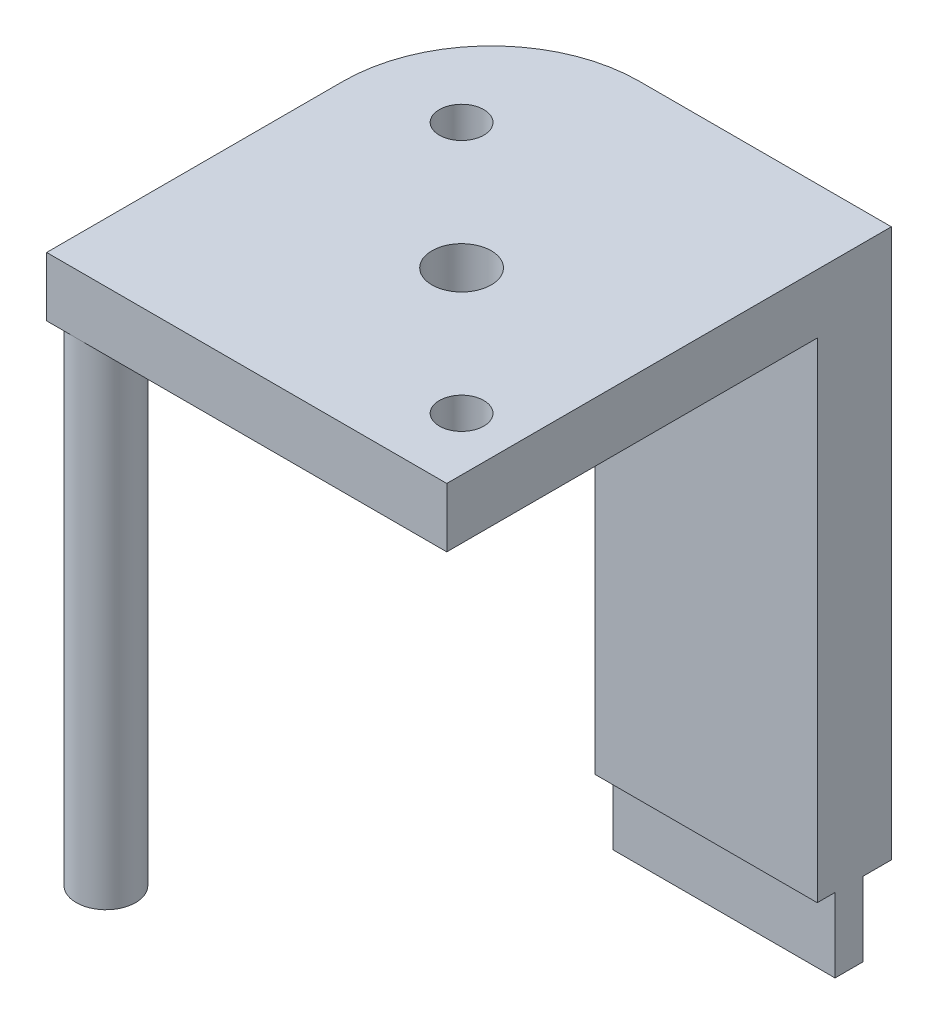
ISO-10303-21;
HEADER;
FILE_DESCRIPTION(('STEP AP214'),'2;1');
FILE_NAME('part.step','',(''),(''),'','','');
FILE_SCHEMA(('AUTOMOTIVE_DESIGN { 1 0 10303 214 1 1 1 1 }'));
ENDSEC;
DATA;
#1=APPLICATION_CONTEXT('core data for automotive mechanical design processes');
#2=APPLICATION_PROTOCOL_DEFINITION('international standard','automotive_design',2000,#1);
#3=PRODUCT_CONTEXT('',#1,'mechanical');
#4=PRODUCT('Part','Part','',(#3));
#5=PRODUCT_RELATED_PRODUCT_CATEGORY('part','',(#4));
#6=PRODUCT_DEFINITION_FORMATION('','',#4);
#7=PRODUCT_DEFINITION_CONTEXT('part definition',#1,'design');
#8=PRODUCT_DEFINITION('design','',#6,#7);
#9=PRODUCT_DEFINITION_SHAPE('','',#8);
#10=(LENGTH_UNIT() NAMED_UNIT(*) SI_UNIT(.MILLI.,.METRE.));
#11=(NAMED_UNIT(*) PLANE_ANGLE_UNIT() SI_UNIT($,.RADIAN.));
#12=(NAMED_UNIT(*) SI_UNIT($,.STERADIAN.) SOLID_ANGLE_UNIT());
#13=UNCERTAINTY_MEASURE_WITH_UNIT(LENGTH_MEASURE(1.E-05),#10,'distance_accuracy_value','');
#14=(GEOMETRIC_REPRESENTATION_CONTEXT(3) GLOBAL_UNCERTAINTY_ASSIGNED_CONTEXT((#13)) GLOBAL_UNIT_ASSIGNED_CONTEXT((#10,
#11,#12)) REPRESENTATION_CONTEXT('',''));
#15=CARTESIAN_POINT('',(0.,0.,0.));
#16=DIRECTION('',(0.,0.,1.));
#17=DIRECTION('',(1.,0.,0.));
#18=AXIS2_PLACEMENT_3D('',#15,#16,#17);
#19=CARTESIAN_POINT('',(-3.5,0.,-5.));
#20=DIRECTION('',(0.,-1.,0.));
#21=DIRECTION('',(0.,0.,-1.));
#22=AXIS2_PLACEMENT_3D('',#19,#20,#21);
#23=PLANE('',#22);
#24=DIRECTION('',(-1.,0.,0.));
#25=VECTOR('',#24,1.);
#26=CARTESIAN_POINT('',(-1.5,0.,-11.2));
#27=LINE('',#26,#25);
#28=CARTESIAN_POINT('',(13.5,0.,-11.2));
#29=VERTEX_POINT('',#28);
#30=CARTESIAN_POINT('',(-1.5,0.,-11.2));
#31=VERTEX_POINT('',#30);
#32=EDGE_CURVE('E89',#29,#31,#27,.T.);
#33=ORIENTED_EDGE('',*,*,#32,.F.);
#34=DIRECTION('',(0.,0.,-1.));
#35=VECTOR('',#34,1.);
#36=CARTESIAN_POINT('',(13.5,0.,-15.));
#37=LINE('',#36,#35);
#38=CARTESIAN_POINT('',(13.5,0.,-10.));
#39=VERTEX_POINT('',#38);
#40=EDGE_CURVE('E280',#39,#29,#37,.T.);
#41=ORIENTED_EDGE('',*,*,#40,.F.);
#42=DIRECTION('',(1.,0.,0.));
#43=VECTOR('',#42,1.);
#44=CARTESIAN_POINT('',(0.,0.,-10.));
#45=LINE('',#44,#43);
#46=CARTESIAN_POINT('',(-1.5,0.,-10.));
#47=VERTEX_POINT('',#46);
#48=EDGE_CURVE('E240',#47,#39,#45,.T.);
#49=ORIENTED_EDGE('',*,*,#48,.F.);
#50=DIRECTION('',(0.,0.,1.));
#51=VECTOR('',#50,1.);
#52=CARTESIAN_POINT('',(-1.5,0.,0.));
#53=LINE('',#52,#51);
#54=EDGE_CURVE('E94',#31,#47,#53,.T.);
#55=ORIENTED_EDGE('',*,*,#54,.F.);
#56=EDGE_LOOP('',(#33,#41,#49,#55));
#57=FACE_BOUND('',#56,.T.);
#58=ADVANCED_FACE('F71',(#57),#23,.T.);
#59=CARTESIAN_POINT('',(-13.5,37.,-5.));
#60=DIRECTION('',(1.,0.,0.));
#61=DIRECTION('',(0.,0.,-1.));
#62=AXIS2_PLACEMENT_3D('',#59,#60,#61);
#63=PLANE('',#62);
#64=DIRECTION('',(0.,0.,1.));
#65=VECTOR('',#64,1.);
#66=CARTESIAN_POINT('',(-13.5,33.,0.));
#67=LINE('',#66,#65);
#68=CARTESIAN_POINT('',(-13.5,33.,13.));
#69=VERTEX_POINT('',#68);
#70=CARTESIAN_POINT('',(-13.5,33.,15.));
#71=VERTEX_POINT('',#70);
#72=EDGE_CURVE('E197',#69,#71,#67,.T.);
#73=ORIENTED_EDGE('',*,*,#72,.T.);
#74=DIRECTION('',(0.,-1.,0.));
#75=VECTOR('',#74,1.);
#76=CARTESIAN_POINT('',(-13.5,37.,15.));
#77=LINE('',#76,#75);
#78=CARTESIAN_POINT('',(-13.5,37.,15.));
#79=VERTEX_POINT('',#78);
#80=EDGE_CURVE('E289',#79,#71,#77,.T.);
#81=ORIENTED_EDGE('',*,*,#80,.F.);
#82=DIRECTION('',(0.,0.,1.));
#83=VECTOR('',#82,1.);
#84=CARTESIAN_POINT('',(-13.5,37.,-5.));
#85=LINE('',#84,#83);
#86=CARTESIAN_POINT('',(-13.5,37.,-5.));
#87=VERTEX_POINT('',#86);
#88=EDGE_CURVE('E273',#87,#79,#85,.T.);
#89=ORIENTED_EDGE('',*,*,#88,.F.);
#90=DIRECTION('',(0.,-1.,0.));
#91=VECTOR('',#90,1.);
#92=CARTESIAN_POINT('',(-13.5,37.,-5.));
#93=LINE('',#92,#91);
#94=CARTESIAN_POINT('',(-13.5,33.,-5.));
#95=VERTEX_POINT('',#94);
#96=EDGE_CURVE('E293',#87,#95,#93,.T.);
#97=ORIENTED_EDGE('',*,*,#96,.T.);
#98=DIRECTION('',(0.,0.,1.));
#99=VECTOR('',#98,1.);
#100=CARTESIAN_POINT('',(-13.5,33.,0.));
#101=LINE('',#100,#99);
#102=EDGE_CURVE('E236',#95,#69,#101,.T.);
#103=ORIENTED_EDGE('',*,*,#102,.T.);
#104=EDGE_LOOP('',(#73,#81,#89,#97,#103));
#105=FACE_BOUND('',#104,.T.);
#106=ADVANCED_FACE('F378',(#105),#63,.F.);
#107=CARTESIAN_POINT('',(-13.5,37.,15.));
#108=DIRECTION('',(0.,0.,-1.));
#109=DIRECTION('',(-1.,0.,0.));
#110=AXIS2_PLACEMENT_3D('',#107,#108,#109);
#111=PLANE('',#110);
#112=DIRECTION('',(1.,0.,0.));
#113=VECTOR('',#112,1.);
#114=CARTESIAN_POINT('',(0.,33.,15.));
#115=LINE('',#114,#113);
#116=CARTESIAN_POINT('',(-11.5,33.,15.));
#117=VERTEX_POINT('',#116);
#118=EDGE_CURVE('E210',#71,#117,#115,.T.);
#119=ORIENTED_EDGE('',*,*,#118,.T.);
#120=DIRECTION('',(1.,0.,0.));
#121=VECTOR('',#120,1.);
#122=CARTESIAN_POINT('',(0.,33.,15.));
#123=LINE('',#122,#121);
#124=CARTESIAN_POINT('',(13.5,33.,15.));
#125=VERTEX_POINT('',#124);
#126=EDGE_CURVE('E228',#117,#125,#123,.T.);
#127=ORIENTED_EDGE('',*,*,#126,.T.);
#128=DIRECTION('',(0.,-1.,0.));
#129=VECTOR('',#128,1.);
#130=CARTESIAN_POINT('',(13.5,37.,15.));
#131=LINE('',#130,#129);
#132=CARTESIAN_POINT('',(13.5,37.,15.));
#133=VERTEX_POINT('',#132);
#134=EDGE_CURVE('E279',#133,#125,#131,.T.);
#135=ORIENTED_EDGE('',*,*,#134,.F.);
#136=DIRECTION('',(1.,0.,0.));
#137=VECTOR('',#136,1.);
#138=CARTESIAN_POINT('',(-13.5,37.,15.));
#139=LINE('',#138,#137);
#140=EDGE_CURVE('E276',#79,#133,#139,.T.);
#141=ORIENTED_EDGE('',*,*,#140,.F.);
#142=ORIENTED_EDGE('',*,*,#80,.T.);
#143=EDGE_LOOP('',(#119,#127,#135,#141,#142));
#144=FACE_BOUND('',#143,.T.);
#145=ADVANCED_FACE('F366',(#144),#111,.F.);
#146=CARTESIAN_POINT('',(-3.5,37.,-5.));
#147=DIRECTION('',(0.,-1.,0.));
#148=DIRECTION('',(0.,0.,-1.));
#149=AXIS2_PLACEMENT_3D('',#146,#147,#148);
#150=CYLINDRICAL_SURFACE('',#149,10.);
#151=CARTESIAN_POINT('',(-3.5,33.,-5.));
#152=DIRECTION('',(0.,-1.,0.));
#153=DIRECTION('',(0.,0.,-1.));
#154=AXIS2_PLACEMENT_3D('',#151,#152,#153);
#155=CIRCLE('',#154,10.);
#156=CARTESIAN_POINT('',(-3.5,33.,-15.));
#157=VERTEX_POINT('',#156);
#158=EDGE_CURVE('E258',#95,#157,#155,.T.);
#159=ORIENTED_EDGE('',*,*,#158,.F.);
#160=ORIENTED_EDGE('',*,*,#96,.F.);
#161=CARTESIAN_POINT('',(-3.5,37.,-5.));
#162=DIRECTION('',(0.,1.,0.));
#163=DIRECTION('',(0.,0.,-1.));
#164=AXIS2_PLACEMENT_3D('',#161,#162,#163);
#165=CIRCLE('',#164,10.);
#166=CARTESIAN_POINT('',(-3.5,37.,-15.));
#167=VERTEX_POINT('',#166);
#168=EDGE_CURVE('E270',#167,#87,#165,.T.);
#169=ORIENTED_EDGE('',*,*,#168,.F.);
#170=DIRECTION('',(0.,-1.,0.));
#171=VECTOR('',#170,1.);
#172=CARTESIAN_POINT('',(-3.5,37.,-15.));
#173=LINE('',#172,#171);
#174=EDGE_CURVE('E81',#167,#157,#173,.T.);
#175=ORIENTED_EDGE('',*,*,#174,.T.);
#176=EDGE_LOOP('',(#159,#160,#169,#175));
#177=FACE_BOUND('',#176,.T.);
#178=ADVANCED_FACE('F373',(#177),#150,.T.);
#179=CARTESIAN_POINT('',(-11.5,0.,13.));
#180=DIRECTION('',(0.,1.,0.));
#181=DIRECTION('',(0.,0.,1.));
#182=AXIS2_PLACEMENT_3D('',#179,#180,#181);
#183=CIRCLE('',#182,2.);
#184=CARTESIAN_POINT('',(-11.5,0.,15.));
#185=VERTEX_POINT('',#184);
#186=EDGE_CURVE('E214',#185,#185,#183,.T.);
#187=ORIENTED_EDGE('',*,*,#186,.F.);
#188=EDGE_LOOP('',(#187));
#189=FACE_BOUND('',#188,.T.);
#190=ADVANCED_FACE('F397',(#189),#23,.T.);
#191=CARTESIAN_POINT('',(13.5,37.,-15.));
#192=DIRECTION('',(-1.,0.,0.));
#193=DIRECTION('',(0.,0.,1.));
#194=AXIS2_PLACEMENT_3D('',#191,#192,#193);
#195=PLANE('',#194);
#196=DIRECTION('',(0.,0.,1.));
#197=VECTOR('',#196,1.);
#198=CARTESIAN_POINT('',(13.5,33.,0.));
#199=LINE('',#198,#197);
#200=CARTESIAN_POINT('',(13.5,33.,-10.));
#201=VERTEX_POINT('',#200);
#202=EDGE_CURVE('E225',#201,#125,#199,.T.);
#203=ORIENTED_EDGE('',*,*,#202,.F.);
#204=DIRECTION('',(0.,-1.,0.));
#205=VECTOR('',#204,1.);
#206=CARTESIAN_POINT('',(13.5,77.3608721412211,-10.));
#207=LINE('',#206,#205);
#208=EDGE_CURVE('E219',#201,#39,#207,.T.);
#209=ORIENTED_EDGE('',*,*,#208,.T.);
#210=ORIENTED_EDGE('',*,*,#40,.T.);
#211=DIRECTION('',(0.,1.,0.));
#212=VECTOR('',#211,1.);
#213=CARTESIAN_POINT('',(13.5,-5.,-11.2));
#214=LINE('',#213,#212);
#215=CARTESIAN_POINT('',(13.5,-5.,-11.2));
#216=VERTEX_POINT('',#215);
#217=EDGE_CURVE('E204',#216,#29,#214,.T.);
#218=ORIENTED_EDGE('',*,*,#217,.F.);
#219=DIRECTION('',(0.,0.,1.));
#220=VECTOR('',#219,1.);
#221=CARTESIAN_POINT('',(13.5,-5.,-11.2));
#222=LINE('',#221,#220);
#223=CARTESIAN_POINT('',(13.5,-5.,-13.1));
#224=VERTEX_POINT('',#223);
#225=EDGE_CURVE('E179',#224,#216,#222,.T.);
#226=ORIENTED_EDGE('',*,*,#225,.F.);
#227=DIRECTION('',(0.,1.,0.));
#228=VECTOR('',#227,1.);
#229=CARTESIAN_POINT('',(13.5,-5.,-13.1));
#230=LINE('',#229,#228);
#231=CARTESIAN_POINT('',(13.5,0.,-13.1));
#232=VERTEX_POINT('',#231);
#233=EDGE_CURVE('E175',#224,#232,#230,.T.);
#234=ORIENTED_EDGE('',*,*,#233,.T.);
#235=CARTESIAN_POINT('',(13.5,0.,-15.));
#236=VERTEX_POINT('',#235);
#237=EDGE_CURVE('E261',#232,#236,#37,.T.);
#238=ORIENTED_EDGE('',*,*,#237,.T.);
#239=DIRECTION('',(0.,-1.,0.));
#240=VECTOR('',#239,1.);
#241=CARTESIAN_POINT('',(13.5,37.,-15.));
#242=LINE('',#241,#240);
#243=CARTESIAN_POINT('',(13.5,37.,-15.));
#244=VERTEX_POINT('',#243);
#245=EDGE_CURVE('E13',#244,#236,#242,.T.);
#246=ORIENTED_EDGE('',*,*,#245,.F.);
#247=DIRECTION('',(0.,0.,-1.));
#248=VECTOR('',#247,1.);
#249=CARTESIAN_POINT('',(13.5,37.,-15.));
#250=LINE('',#249,#248);
#251=EDGE_CURVE('E262',#133,#244,#250,.T.);
#252=ORIENTED_EDGE('',*,*,#251,.F.);
#253=ORIENTED_EDGE('',*,*,#134,.T.);
#254=EDGE_LOOP('',(#203,#209,#210,#218,#226,#234,#238,#246,#252,#253));
#255=FACE_BOUND('',#254,.T.);
#256=ADVANCED_FACE('F73',(#255),#195,.F.);
#257=CARTESIAN_POINT('',(-3.5,37.,-15.));
#258=DIRECTION('',(0.,0.,1.));
#259=DIRECTION('',(1.,0.,0.));
#260=AXIS2_PLACEMENT_3D('',#257,#258,#259);
#261=PLANE('',#260);
#262=DIRECTION('',(-1.,0.,0.));
#263=VECTOR('',#262,1.);
#264=CARTESIAN_POINT('',(-3.5,0.,-15.));
#265=LINE('',#264,#263);
#266=CARTESIAN_POINT('',(-1.5,0.,-15.));
#267=VERTEX_POINT('',#266);
#268=EDGE_CURVE('E267',#236,#267,#265,.T.);
#269=ORIENTED_EDGE('',*,*,#268,.T.);
#270=DIRECTION('',(0.,-1.,0.));
#271=VECTOR('',#270,1.);
#272=CARTESIAN_POINT('',(-1.5,77.3608721412211,-15.));
#273=LINE('',#272,#271);
#274=CARTESIAN_POINT('',(-1.5,33.,-15.));
#275=VERTEX_POINT('',#274);
#276=EDGE_CURVE('E245',#275,#267,#273,.T.);
#277=ORIENTED_EDGE('',*,*,#276,.F.);
#278=DIRECTION('',(1.,0.,0.));
#279=VECTOR('',#278,1.);
#280=CARTESIAN_POINT('',(0.,33.,-15.));
#281=LINE('',#280,#279);
#282=EDGE_CURVE('E215',#157,#275,#281,.T.);
#283=ORIENTED_EDGE('',*,*,#282,.F.);
#284=ORIENTED_EDGE('',*,*,#174,.F.);
#285=DIRECTION('',(-1.,0.,0.));
#286=VECTOR('',#285,1.);
#287=CARTESIAN_POINT('',(-3.5,37.,-15.));
#288=LINE('',#287,#286);
#289=EDGE_CURVE('E266',#244,#167,#288,.T.);
#290=ORIENTED_EDGE('',*,*,#289,.F.);
#291=ORIENTED_EDGE('',*,*,#245,.T.);
#292=EDGE_LOOP('',(#269,#277,#283,#284,#290,#291));
#293=FACE_BOUND('',#292,.T.);
#294=ADVANCED_FACE('F357',(#293),#261,.F.);
#295=CARTESIAN_POINT('',(-3.5,37.,-5.));
#296=DIRECTION('',(0.,-1.,0.));
#297=DIRECTION('',(0.,0.,-1.));
#298=AXIS2_PLACEMENT_3D('',#295,#296,#297);
#299=PLANE('',#298);
#300=CARTESIAN_POINT('',(-7.1,37.,-6.6));
#301=DIRECTION('',(0.,1.,0.));
#302=DIRECTION('',(0.,0.,1.));
#303=AXIS2_PLACEMENT_3D('',#300,#301,#302);
#304=CIRCLE('',#303,1.5);
#305=CARTESIAN_POINT('',(-7.1,37.,-5.1));
#306=VERTEX_POINT('',#305);
#307=EDGE_CURVE('E302',#306,#306,#304,.T.);
#308=ORIENTED_EDGE('',*,*,#307,.F.);
#309=EDGE_LOOP('',(#308));
#310=FACE_BOUND('',#309,.T.);
#311=CARTESIAN_POINT('',(9.9,37.,10.4));
#312=DIRECTION('',(0.,1.,0.));
#313=DIRECTION('',(0.,0.,1.));
#314=AXIS2_PLACEMENT_3D('',#311,#312,#313);
#315=CIRCLE('',#314,1.5);
#316=CARTESIAN_POINT('',(9.9,37.,11.9));
#317=VERTEX_POINT('',#316);
#318=EDGE_CURVE('E310',#317,#317,#315,.T.);
#319=ORIENTED_EDGE('',*,*,#318,.F.);
#320=EDGE_LOOP('',(#319));
#321=FACE_BOUND('',#320,.T.);
#322=CARTESIAN_POINT('',(1.4,37.,1.9));
#323=DIRECTION('',(0.,-1.,0.));
#324=DIRECTION('',(0.,0.,-1.));
#325=AXIS2_PLACEMENT_3D('',#322,#323,#324);
#326=CIRCLE('',#325,2.);
#327=CARTESIAN_POINT('',(1.4,37.,-0.100000000000003));
#328=VERTEX_POINT('',#327);
#329=EDGE_CURVE('E321',#328,#328,#326,.T.);
#330=ORIENTED_EDGE('',*,*,#329,.T.);
#331=EDGE_LOOP('',(#330));
#332=FACE_BOUND('',#331,.T.);
#333=ORIENTED_EDGE('',*,*,#251,.T.);
#334=ORIENTED_EDGE('',*,*,#289,.T.);
#335=ORIENTED_EDGE('',*,*,#168,.T.);
#336=ORIENTED_EDGE('',*,*,#88,.T.);
#337=ORIENTED_EDGE('',*,*,#140,.T.);
#338=EDGE_LOOP('',(#333,#334,#335,#336,#337));
#339=FACE_BOUND('',#338,.T.);
#340=ADVANCED_FACE('F362',(#310,#321,#332,#339),#299,.F.);
#341=DIRECTION('',(1.,0.,0.));
#342=VECTOR('',#341,1.);
#343=CARTESIAN_POINT('',(-1.5,0.,-13.1));
#344=LINE('',#343,#342);
#345=CARTESIAN_POINT('',(-1.5,0.,-13.1));
#346=VERTEX_POINT('',#345);
#347=EDGE_CURVE('E324',#346,#232,#344,.T.);
#348=ORIENTED_EDGE('',*,*,#347,.F.);
#349=EDGE_CURVE('E195',#267,#346,#53,.T.);
#350=ORIENTED_EDGE('',*,*,#349,.F.);
#351=ORIENTED_EDGE('',*,*,#268,.F.);
#352=ORIENTED_EDGE('',*,*,#237,.F.);
#353=EDGE_LOOP('',(#348,#350,#351,#352));
#354=FACE_BOUND('',#353,.T.);
#355=ADVANCED_FACE('F355',(#354),#23,.T.);
#356=CARTESIAN_POINT('',(-3.5,33.,-5.));
#357=DIRECTION('',(0.,-1.,0.));
#358=DIRECTION('',(0.,0.,-1.));
#359=AXIS2_PLACEMENT_3D('',#356,#357,#358);
#360=PLANE('',#359);
#361=CARTESIAN_POINT('',(-7.1,33.,-6.6));
#362=DIRECTION('',(0.,-1.,0.));
#363=DIRECTION('',(0.,0.,-1.));
#364=AXIS2_PLACEMENT_3D('',#361,#362,#363);
#365=CIRCLE('',#364,1.5);
#366=CARTESIAN_POINT('',(-7.1,33.,-8.1));
#367=VERTEX_POINT('',#366);
#368=EDGE_CURVE('E75',#367,#367,#365,.T.);
#369=ORIENTED_EDGE('',*,*,#368,.F.);
#370=EDGE_LOOP('',(#369));
#371=FACE_BOUND('',#370,.T.);
#372=CARTESIAN_POINT('',(9.9,33.,10.4));
#373=DIRECTION('',(0.,-1.,0.));
#374=DIRECTION('',(0.,0.,-1.));
#375=AXIS2_PLACEMENT_3D('',#372,#373,#374);
#376=CIRCLE('',#375,1.5);
#377=CARTESIAN_POINT('',(9.9,33.,8.9));
#378=VERTEX_POINT('',#377);
#379=EDGE_CURVE('E299',#378,#378,#376,.T.);
#380=ORIENTED_EDGE('',*,*,#379,.F.);
#381=EDGE_LOOP('',(#380));
#382=FACE_BOUND('',#381,.T.);
#383=CARTESIAN_POINT('',(1.4,33.,1.9));
#384=DIRECTION('',(0.,-1.,0.));
#385=DIRECTION('',(0.,0.,-1.));
#386=AXIS2_PLACEMENT_3D('',#383,#384,#385);
#387=CIRCLE('',#386,2.);
#388=CARTESIAN_POINT('',(1.4,33.,-0.100000000000003));
#389=VERTEX_POINT('',#388);
#390=EDGE_CURVE('E308',#389,#389,#387,.T.);
#391=ORIENTED_EDGE('',*,*,#390,.F.);
#392=EDGE_LOOP('',(#391));
#393=FACE_BOUND('',#392,.T.);
#394=ORIENTED_EDGE('',*,*,#158,.T.);
#395=ORIENTED_EDGE('',*,*,#282,.T.);
#396=DIRECTION('',(0.,0.,-1.));
#397=VECTOR('',#396,1.);
#398=CARTESIAN_POINT('',(-1.5,33.,0.));
#399=LINE('',#398,#397);
#400=CARTESIAN_POINT('',(-1.5,33.,-10.));
#401=VERTEX_POINT('',#400);
#402=EDGE_CURVE('E218',#401,#275,#399,.T.);
#403=ORIENTED_EDGE('',*,*,#402,.F.);
#404=DIRECTION('',(-1.,0.,0.));
#405=VECTOR('',#404,1.);
#406=CARTESIAN_POINT('',(0.,33.,-10.));
#407=LINE('',#406,#405);
#408=EDGE_CURVE('E222',#201,#401,#407,.T.);
#409=ORIENTED_EDGE('',*,*,#408,.F.);
#410=ORIENTED_EDGE('',*,*,#202,.T.);
#411=ORIENTED_EDGE('',*,*,#126,.F.);
#412=CARTESIAN_POINT('',(-11.5,33.,13.));
#413=DIRECTION('',(0.,-1.,0.));
#414=DIRECTION('',(0.,0.,-1.));
#415=AXIS2_PLACEMENT_3D('',#412,#413,#414);
#416=CIRCLE('',#415,2.);
#417=EDGE_CURVE('E232',#69,#117,#416,.T.);
#418=ORIENTED_EDGE('',*,*,#417,.F.);
#419=ORIENTED_EDGE('',*,*,#102,.F.);
#420=EDGE_LOOP('',(#394,#395,#403,#409,#410,#411,#418,#419));
#421=FACE_BOUND('',#420,.T.);
#422=ADVANCED_FACE('F370',(#371,#382,#393,#421),#360,.T.);
#423=CARTESIAN_POINT('',(-11.5,77.3608721412211,13.));
#424=DIRECTION('',(0.,-1.,0.));
#425=DIRECTION('',(0.,0.,-1.));
#426=AXIS2_PLACEMENT_3D('',#423,#424,#425);
#427=CYLINDRICAL_SURFACE('',#426,2.);
#428=ORIENTED_EDGE('',*,*,#186,.T.);
#429=EDGE_LOOP('',(#428));
#430=FACE_BOUND('',#429,.T.);
#431=ORIENTED_EDGE('',*,*,#417,.T.);
#432=CARTESIAN_POINT('',(-11.5,33.,13.));
#433=DIRECTION('',(0.,-1.,0.));
#434=DIRECTION('',(0.,0.,-1.));
#435=AXIS2_PLACEMENT_3D('',#432,#433,#434);
#436=CIRCLE('',#435,2.);
#437=EDGE_CURVE('E202',#117,#69,#436,.T.);
#438=ORIENTED_EDGE('',*,*,#437,.T.);
#439=EDGE_LOOP('',(#431,#438));
#440=FACE_BOUND('',#439,.T.);
#441=ADVANCED_FACE('F383',(#430,#440),#427,.T.);
#442=CARTESIAN_POINT('',(0.,77.3608721412211,-10.));
#443=DIRECTION('',(0.,0.,-1.));
#444=DIRECTION('',(-1.,0.,0.));
#445=AXIS2_PLACEMENT_3D('',#442,#443,#444);
#446=PLANE('',#445);
#447=ORIENTED_EDGE('',*,*,#408,.T.);
#448=DIRECTION('',(0.,-1.,0.));
#449=VECTOR('',#448,1.);
#450=CARTESIAN_POINT('',(-1.5,77.3608721412211,-10.));
#451=LINE('',#450,#449);
#452=EDGE_CURVE('E248',#401,#47,#451,.T.);
#453=ORIENTED_EDGE('',*,*,#452,.T.);
#454=ORIENTED_EDGE('',*,*,#48,.T.);
#455=ORIENTED_EDGE('',*,*,#208,.F.);
#456=EDGE_LOOP('',(#447,#453,#454,#455));
#457=FACE_BOUND('',#456,.T.);
#458=ADVANCED_FACE('F345',(#457),#446,.F.);
#459=CARTESIAN_POINT('',(-1.5,77.3608721412211,0.));
#460=DIRECTION('',(1.,0.,0.));
#461=DIRECTION('',(0.,0.,-1.));
#462=AXIS2_PLACEMENT_3D('',#459,#460,#461);
#463=PLANE('',#462);
#464=ORIENTED_EDGE('',*,*,#402,.T.);
#465=ORIENTED_EDGE('',*,*,#276,.T.);
#466=ORIENTED_EDGE('',*,*,#349,.T.);
#467=DIRECTION('',(0.,1.,0.));
#468=VECTOR('',#467,1.);
#469=CARTESIAN_POINT('',(-1.5,-5.,-13.1));
#470=LINE('',#469,#468);
#471=CARTESIAN_POINT('',(-1.5,-5.,-13.1));
#472=VERTEX_POINT('',#471);
#473=EDGE_CURVE('E173',#472,#346,#470,.T.);
#474=ORIENTED_EDGE('',*,*,#473,.F.);
#475=DIRECTION('',(0.,0.,-1.));
#476=VECTOR('',#475,1.);
#477=CARTESIAN_POINT('',(-1.5,-5.,-11.2));
#478=LINE('',#477,#476);
#479=CARTESIAN_POINT('',(-1.5,-5.,-11.2));
#480=VERTEX_POINT('',#479);
#481=EDGE_CURVE('E180',#480,#472,#478,.T.);
#482=ORIENTED_EDGE('',*,*,#481,.F.);
#483=DIRECTION('',(0.,1.,0.));
#484=VECTOR('',#483,1.);
#485=CARTESIAN_POINT('',(-1.5,-5.,-11.2));
#486=LINE('',#485,#484);
#487=EDGE_CURVE('E330',#480,#31,#486,.T.);
#488=ORIENTED_EDGE('',*,*,#487,.T.);
#489=ORIENTED_EDGE('',*,*,#54,.T.);
#490=ORIENTED_EDGE('',*,*,#452,.F.);
#491=EDGE_LOOP('',(#464,#465,#466,#474,#482,#488,#489,#490));
#492=FACE_BOUND('',#491,.T.);
#493=ADVANCED_FACE('F193',(#492),#463,.F.);
#494=CARTESIAN_POINT('',(-3.5,33.,-5.));
#495=DIRECTION('',(0.,-1.,0.));
#496=DIRECTION('',(0.,0.,-1.));
#497=AXIS2_PLACEMENT_3D('',#494,#495,#496);
#498=PLANE('',#497);
#499=ORIENTED_EDGE('',*,*,#437,.F.);
#500=ORIENTED_EDGE('',*,*,#118,.F.);
#501=ORIENTED_EDGE('',*,*,#72,.F.);
#502=EDGE_LOOP('',(#499,#500,#501));
#503=FACE_BOUND('',#502,.T.);
#504=ADVANCED_FACE('F381',(#503),#498,.T.);
#505=CARTESIAN_POINT('',(-1.5,-5.,-13.1));
#506=DIRECTION('',(0.,0.,1.));
#507=DIRECTION('',(1.,0.,0.));
#508=AXIS2_PLACEMENT_3D('',#505,#506,#507);
#509=PLANE('',#508);
#510=ORIENTED_EDGE('',*,*,#347,.T.);
#511=ORIENTED_EDGE('',*,*,#233,.F.);
#512=DIRECTION('',(1.,0.,0.));
#513=VECTOR('',#512,1.);
#514=CARTESIAN_POINT('',(-1.5,-5.,-13.1));
#515=LINE('',#514,#513);
#516=EDGE_CURVE('E168',#472,#224,#515,.T.);
#517=ORIENTED_EDGE('',*,*,#516,.F.);
#518=ORIENTED_EDGE('',*,*,#473,.T.);
#519=EDGE_LOOP('',(#510,#511,#517,#518));
#520=FACE_BOUND('',#519,.T.);
#521=ADVANCED_FACE('F171',(#520),#509,.F.);
#522=CARTESIAN_POINT('',(-1.5,-5.,-11.2));
#523=DIRECTION('',(0.,0.,-1.));
#524=DIRECTION('',(-1.,0.,0.));
#525=AXIS2_PLACEMENT_3D('',#522,#523,#524);
#526=PLANE('',#525);
#527=ORIENTED_EDGE('',*,*,#32,.T.);
#528=ORIENTED_EDGE('',*,*,#487,.F.);
#529=DIRECTION('',(-1.,0.,0.));
#530=VECTOR('',#529,1.);
#531=CARTESIAN_POINT('',(-1.5,-5.,-11.2));
#532=LINE('',#531,#530);
#533=EDGE_CURVE('E185',#216,#480,#532,.T.);
#534=ORIENTED_EDGE('',*,*,#533,.F.);
#535=ORIENTED_EDGE('',*,*,#217,.T.);
#536=EDGE_LOOP('',(#527,#528,#534,#535));
#537=FACE_BOUND('',#536,.T.);
#538=ADVANCED_FACE('F340',(#537),#526,.F.);
#539=CARTESIAN_POINT('',(0.,-5.,0.));
#540=DIRECTION('',(0.,-1.,0.));
#541=DIRECTION('',(0.,0.,-1.));
#542=AXIS2_PLACEMENT_3D('',#539,#540,#541);
#543=PLANE('',#542);
#544=ORIENTED_EDGE('',*,*,#481,.T.);
#545=ORIENTED_EDGE('',*,*,#516,.T.);
#546=ORIENTED_EDGE('',*,*,#225,.T.);
#547=ORIENTED_EDGE('',*,*,#533,.T.);
#548=EDGE_LOOP('',(#544,#545,#546,#547));
#549=FACE_BOUND('',#548,.T.);
#550=ADVANCED_FACE('F183',(#549),#543,.T.);
#551=CARTESIAN_POINT('',(1.4,43.,1.9));
#552=DIRECTION('',(0.,-1.,0.));
#553=DIRECTION('',(0.,0.,-1.));
#554=AXIS2_PLACEMENT_3D('',#551,#552,#553);
#555=CYLINDRICAL_SURFACE('',#554,2.);
#556=ORIENTED_EDGE('',*,*,#390,.T.);
#557=EDGE_LOOP('',(#556));
#558=FACE_BOUND('',#557,.T.);
#559=ORIENTED_EDGE('',*,*,#329,.F.);
#560=EDGE_LOOP('',(#559));
#561=FACE_BOUND('',#560,.T.);
#562=ADVANCED_FACE('F418',(#558,#561),#555,.F.);
#563=CARTESIAN_POINT('',(9.9,-5.,10.4));
#564=DIRECTION('',(0.,1.,0.));
#565=DIRECTION('',(0.,0.,1.));
#566=AXIS2_PLACEMENT_3D('',#563,#564,#565);
#567=CYLINDRICAL_SURFACE('',#566,1.5);
#568=ORIENTED_EDGE('',*,*,#379,.T.);
#569=EDGE_LOOP('',(#568));
#570=FACE_BOUND('',#569,.T.);
#571=ORIENTED_EDGE('',*,*,#318,.T.);
#572=EDGE_LOOP('',(#571));
#573=FACE_BOUND('',#572,.T.);
#574=ADVANCED_FACE('F420',(#570,#573),#567,.F.);
#575=CARTESIAN_POINT('',(-7.1,-5.,-6.6));
#576=DIRECTION('',(0.,1.,0.));
#577=DIRECTION('',(0.,0.,1.));
#578=AXIS2_PLACEMENT_3D('',#575,#576,#577);
#579=CYLINDRICAL_SURFACE('',#578,1.5);
#580=ORIENTED_EDGE('',*,*,#368,.T.);
#581=EDGE_LOOP('',(#580));
#582=FACE_BOUND('',#581,.T.);
#583=ORIENTED_EDGE('',*,*,#307,.T.);
#584=EDGE_LOOP('',(#583));
#585=FACE_BOUND('',#584,.T.);
#586=ADVANCED_FACE('F427',(#582,#585),#579,.F.);
#587=CLOSED_SHELL('',(#58,#106,#145,#178,#190,#256,#294,#340,#355,#422,#441,#458,#493,#504,#521,
#538,#550,#562,#574,#586));
#588=MANIFOLD_SOLID_BREP('B2',#587);
#589=ADVANCED_BREP_SHAPE_REPRESENTATION('',(#18,#588),#14);
#590=SHAPE_DEFINITION_REPRESENTATION(#9,#589);
ENDSEC;
END-ISO-10303-21;
